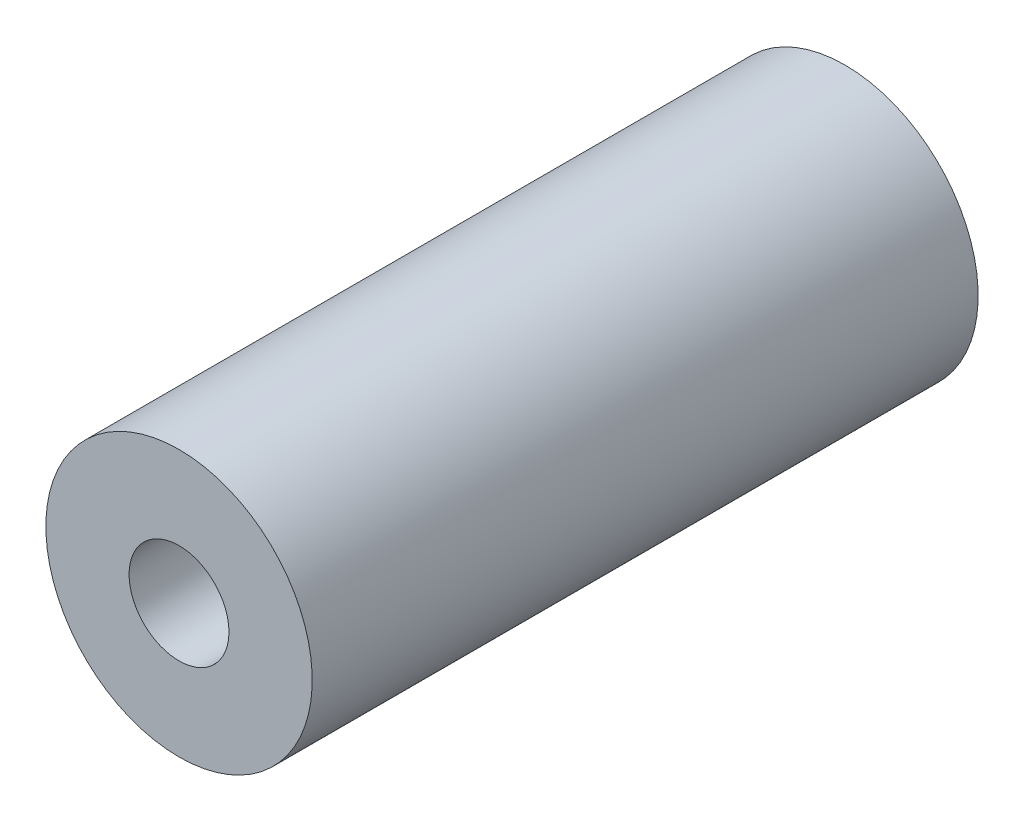
ISO-10303-21;
HEADER;
FILE_DESCRIPTION(('STEP AP214'),'2;1');
FILE_NAME('part.step','',(''),(''),'','','');
FILE_SCHEMA(('AUTOMOTIVE_DESIGN { 1 0 10303 214 1 1 1 1 }'));
ENDSEC;
DATA;
#1=APPLICATION_CONTEXT('core data for automotive mechanical design processes');
#2=APPLICATION_PROTOCOL_DEFINITION('international standard','automotive_design',2000,#1);
#3=PRODUCT_CONTEXT('',#1,'mechanical');
#4=PRODUCT('Part','Part','',(#3));
#5=PRODUCT_RELATED_PRODUCT_CATEGORY('part','',(#4));
#6=PRODUCT_DEFINITION_FORMATION('','',#4);
#7=PRODUCT_DEFINITION_CONTEXT('part definition',#1,'design');
#8=PRODUCT_DEFINITION('design','',#6,#7);
#9=PRODUCT_DEFINITION_SHAPE('','',#8);
#10=(LENGTH_UNIT() NAMED_UNIT(*) SI_UNIT(.MILLI.,.METRE.));
#11=(NAMED_UNIT(*) PLANE_ANGLE_UNIT() SI_UNIT($,.RADIAN.));
#12=(NAMED_UNIT(*) SI_UNIT($,.STERADIAN.) SOLID_ANGLE_UNIT());
#13=UNCERTAINTY_MEASURE_WITH_UNIT(LENGTH_MEASURE(1.E-05),#10,'distance_accuracy_value','');
#14=(GEOMETRIC_REPRESENTATION_CONTEXT(3) GLOBAL_UNCERTAINTY_ASSIGNED_CONTEXT((#13)) GLOBAL_UNIT_ASSIGNED_CONTEXT((#10,
#11,#12)) REPRESENTATION_CONTEXT('',''));
#15=CARTESIAN_POINT('',(0.,0.,0.));
#16=DIRECTION('',(0.,0.,1.));
#17=DIRECTION('',(1.,0.,0.));
#18=AXIS2_PLACEMENT_3D('',#15,#16,#17);
#19=CARTESIAN_POINT('',(0.,-6.,-30.));
#20=DIRECTION('',(0.,0.,1.));
#21=DIRECTION('',(0.,-1.,0.));
#22=AXIS2_PLACEMENT_3D('',#19,#20,#21);
#23=PLANE('',#22);
#24=CARTESIAN_POINT('',(0.,0.,-30.));
#25=DIRECTION('',(0.,0.,-1.));
#26=DIRECTION('',(0.,1.,0.));
#27=AXIS2_PLACEMENT_3D('',#24,#25,#26);
#28=CIRCLE('',#27,6.);
#29=CARTESIAN_POINT('',(0.,6.,-30.));
#30=VERTEX_POINT('',#29);
#31=EDGE_CURVE('E123',#30,#30,#28,.T.);
#32=ORIENTED_EDGE('',*,*,#31,.T.);
#33=EDGE_LOOP('',(#32));
#34=FACE_BOUND('',#33,.T.);
#35=DIRECTION('',(-1.,0.,0.));
#36=VECTOR('',#35,1.);
#37=CARTESIAN_POINT('',(0.,2.67308147399663,-30.));
#38=LINE('',#37,#36);
#39=CARTESIAN_POINT('',(3.62003251827605,2.67308147399663,-30.));
#40=VERTEX_POINT('',#39);
#41=CARTESIAN_POINT('',(-3.62003251827605,2.67308147399663,-30.));
#42=VERTEX_POINT('',#41);
#43=EDGE_CURVE('E55',#40,#42,#38,.T.);
#44=ORIENTED_EDGE('',*,*,#43,.T.);
#45=CARTESIAN_POINT('',(0.,0.,-30.));
#46=DIRECTION('',(0.,0.,-1.));
#47=DIRECTION('',(-1.,0.,0.));
#48=AXIS2_PLACEMENT_3D('',#45,#46,#47);
#49=CIRCLE('',#48,4.5);
#50=EDGE_CURVE('E94',#40,#42,#49,.T.);
#51=ORIENTED_EDGE('',*,*,#50,.F.);
#52=EDGE_LOOP('',(#44,#51));
#53=FACE_BOUND('',#52,.T.);
#54=ADVANCED_FACE('F39',(#34,#53),#23,.F.);
#55=CARTESIAN_POINT('',(0.,0.,-5.));
#56=DIRECTION('',(0.,0.,1.));
#57=DIRECTION('',(1.,0.,0.));
#58=AXIS2_PLACEMENT_3D('',#55,#56,#57);
#59=CYLINDRICAL_SURFACE('',#58,2.25);
#60=CARTESIAN_POINT('',(0.,0.,0.));
#61=DIRECTION('',(0.,0.,1.));
#62=DIRECTION('',(1.,0.,0.));
#63=AXIS2_PLACEMENT_3D('',#60,#61,#62);
#64=CIRCLE('',#63,2.25);
#65=CARTESIAN_POINT('',(2.25,0.,0.));
#66=VERTEX_POINT('',#65);
#67=EDGE_CURVE('E112',#66,#66,#64,.T.);
#68=ORIENTED_EDGE('',*,*,#67,.T.);
#69=EDGE_LOOP('',(#68));
#70=FACE_BOUND('',#69,.T.);
#71=CARTESIAN_POINT('',(0.,0.,-15.));
#72=DIRECTION('',(0.,0.,-1.));
#73=DIRECTION('',(-1.,0.,0.));
#74=AXIS2_PLACEMENT_3D('',#71,#72,#73);
#75=CIRCLE('',#74,2.25);
#76=CARTESIAN_POINT('',(-1.67705098312484,1.5,-15.));
#77=VERTEX_POINT('',#76);
#78=CARTESIAN_POINT('',(1.67705098312484,1.5,-15.));
#79=VERTEX_POINT('',#78);
#80=EDGE_CURVE('E61',#77,#79,#75,.F.);
#81=ORIENTED_EDGE('',*,*,#80,.F.);
#82=DIRECTION('',(0.,0.,1.));
#83=VECTOR('',#82,1.);
#84=CARTESIAN_POINT('',(-1.67705098312484,1.5,-18.));
#85=LINE('',#84,#83);
#86=CARTESIAN_POINT('',(-1.67705098312484,1.5,-5.));
#87=VERTEX_POINT('',#86);
#88=EDGE_CURVE('E108',#77,#87,#85,.T.);
#89=ORIENTED_EDGE('',*,*,#88,.T.);
#90=CARTESIAN_POINT('',(0.,0.,-5.));
#91=DIRECTION('',(0.,0.,1.));
#92=DIRECTION('',(1.,0.,0.));
#93=AXIS2_PLACEMENT_3D('',#90,#91,#92);
#94=CIRCLE('',#93,2.25);
#95=CARTESIAN_POINT('',(1.67705098312484,1.5,-5.));
#96=VERTEX_POINT('',#95);
#97=EDGE_CURVE('E119',#96,#87,#94,.T.);
#98=ORIENTED_EDGE('',*,*,#97,.F.);
#99=DIRECTION('',(0.,0.,1.));
#100=VECTOR('',#99,1.);
#101=CARTESIAN_POINT('',(1.67705098312484,1.5,-18.));
#102=LINE('',#101,#100);
#103=EDGE_CURVE('E109',#79,#96,#102,.T.);
#104=ORIENTED_EDGE('',*,*,#103,.F.);
#105=EDGE_LOOP('',(#81,#89,#98,#104));
#106=FACE_BOUND('',#105,.T.);
#107=ADVANCED_FACE('F144',(#70,#106),#59,.F.);
#108=CARTESIAN_POINT('',(0.,1.5,-18.));
#109=DIRECTION('',(0.,1.,0.));
#110=DIRECTION('',(0.,0.,1.));
#111=AXIS2_PLACEMENT_3D('',#108,#109,#110);
#112=PLANE('',#111);
#113=DIRECTION('',(-1.,0.,0.));
#114=VECTOR('',#113,1.);
#115=CARTESIAN_POINT('',(0.,1.5,-15.));
#116=LINE('',#115,#114);
#117=EDGE_CURVE('E11',#79,#77,#116,.T.);
#118=ORIENTED_EDGE('',*,*,#117,.F.);
#119=ORIENTED_EDGE('',*,*,#103,.T.);
#120=DIRECTION('',(1.,0.,0.));
#121=VECTOR('',#120,1.);
#122=CARTESIAN_POINT('',(0.,1.5,-5.));
#123=LINE('',#122,#121);
#124=EDGE_CURVE('E115',#87,#96,#123,.T.);
#125=ORIENTED_EDGE('',*,*,#124,.F.);
#126=ORIENTED_EDGE('',*,*,#88,.F.);
#127=EDGE_LOOP('',(#118,#119,#125,#126));
#128=FACE_BOUND('',#127,.T.);
#129=ADVANCED_FACE('F136',(#128),#112,.F.);
#130=CARTESIAN_POINT('',(0.,0.,0.));
#131=DIRECTION('',(0.,0.,-1.));
#132=DIRECTION('',(0.,1.,0.));
#133=AXIS2_PLACEMENT_3D('',#130,#131,#132);
#134=PLANE('',#133);
#135=ORIENTED_EDGE('',*,*,#67,.F.);
#136=EDGE_LOOP('',(#135));
#137=FACE_BOUND('',#136,.T.);
#138=CARTESIAN_POINT('',(0.,0.,0.));
#139=DIRECTION('',(0.,0.,-1.));
#140=DIRECTION('',(0.,1.,0.));
#141=AXIS2_PLACEMENT_3D('',#138,#139,#140);
#142=CIRCLE('',#141,6.);
#143=CARTESIAN_POINT('',(0.,6.,0.));
#144=VERTEX_POINT('',#143);
#145=EDGE_CURVE('E48',#144,#144,#142,.T.);
#146=ORIENTED_EDGE('',*,*,#145,.F.);
#147=EDGE_LOOP('',(#146));
#148=FACE_BOUND('',#147,.T.);
#149=ADVANCED_FACE('F41',(#137,#148),#134,.F.);
#150=CARTESIAN_POINT('',(0.,0.,-30.));
#151=DIRECTION('',(0.,0.,-1.));
#152=DIRECTION('',(0.,1.,0.));
#153=AXIS2_PLACEMENT_3D('',#150,#151,#152);
#154=CYLINDRICAL_SURFACE('',#153,6.);
#155=ORIENTED_EDGE('',*,*,#31,.F.);
#156=EDGE_LOOP('',(#155));
#157=FACE_BOUND('',#156,.T.);
#158=ORIENTED_EDGE('',*,*,#145,.T.);
#159=EDGE_LOOP('',(#158));
#160=FACE_BOUND('',#159,.T.);
#161=ADVANCED_FACE('F133',(#157,#160),#154,.T.);
#162=CARTESIAN_POINT('',(0.,0.,-5.));
#163=DIRECTION('',(0.,0.,1.));
#164=DIRECTION('',(1.,0.,0.));
#165=AXIS2_PLACEMENT_3D('',#162,#163,#164);
#166=PLANE('',#165);
#167=ORIENTED_EDGE('',*,*,#124,.T.);
#168=ORIENTED_EDGE('',*,*,#97,.T.);
#169=EDGE_LOOP('',(#167,#168));
#170=FACE_BOUND('',#169,.T.);
#171=ADVANCED_FACE('F142',(#170),#166,.T.);
#172=CARTESIAN_POINT('',(0.,0.,-15.));
#173=DIRECTION('',(0.,0.,-1.));
#174=DIRECTION('',(-1.,0.,0.));
#175=AXIS2_PLACEMENT_3D('',#172,#173,#174);
#176=PLANE('',#175);
#177=DIRECTION('',(-1.,0.,0.));
#178=VECTOR('',#177,1.);
#179=CARTESIAN_POINT('',(0.,2.67308147399663,-15.));
#180=LINE('',#179,#178);
#181=CARTESIAN_POINT('',(3.62003251827605,2.67308147399663,-15.));
#182=VERTEX_POINT('',#181);
#183=CARTESIAN_POINT('',(-3.62003251827605,2.67308147399663,-15.));
#184=VERTEX_POINT('',#183);
#185=EDGE_CURVE('E80',#182,#184,#180,.T.);
#186=ORIENTED_EDGE('',*,*,#185,.F.);
#187=CARTESIAN_POINT('',(0.,0.,-15.));
#188=DIRECTION('',(0.,0.,-1.));
#189=DIRECTION('',(-1.,0.,0.));
#190=AXIS2_PLACEMENT_3D('',#187,#188,#189);
#191=CIRCLE('',#190,4.5);
#192=EDGE_CURVE('E88',#182,#184,#191,.T.);
#193=ORIENTED_EDGE('',*,*,#192,.T.);
#194=EDGE_LOOP('',(#186,#193));
#195=FACE_BOUND('',#194,.T.);
#196=ORIENTED_EDGE('',*,*,#80,.T.);
#197=ORIENTED_EDGE('',*,*,#117,.T.);
#198=EDGE_LOOP('',(#196,#197));
#199=FACE_BOUND('',#198,.T.);
#200=ADVANCED_FACE('F92',(#195,#199),#176,.T.);
#201=CARTESIAN_POINT('',(0.,2.67308147399663,-15.));
#202=DIRECTION('',(0.,-1.,0.));
#203=DIRECTION('',(0.,0.,-1.));
#204=AXIS2_PLACEMENT_3D('',#201,#202,#203);
#205=PLANE('',#204);
#206=ORIENTED_EDGE('',*,*,#43,.F.);
#207=DIRECTION('',(0.,0.,-1.));
#208=VECTOR('',#207,1.);
#209=CARTESIAN_POINT('',(3.62003251827605,2.67308147399663,-15.));
#210=LINE('',#209,#208);
#211=EDGE_CURVE('E77',#182,#40,#210,.T.);
#212=ORIENTED_EDGE('',*,*,#211,.F.);
#213=ORIENTED_EDGE('',*,*,#185,.T.);
#214=DIRECTION('',(0.,0.,-1.));
#215=VECTOR('',#214,1.);
#216=CARTESIAN_POINT('',(-3.62003251827605,2.67308147399663,-15.));
#217=LINE('',#216,#215);
#218=EDGE_CURVE('E87',#184,#42,#217,.T.);
#219=ORIENTED_EDGE('',*,*,#218,.T.);
#220=EDGE_LOOP('',(#206,#212,#213,#219));
#221=FACE_BOUND('',#220,.T.);
#222=ADVANCED_FACE('F79',(#221),#205,.T.);
#223=CARTESIAN_POINT('',(0.,0.,-15.));
#224=DIRECTION('',(0.,0.,-1.));
#225=DIRECTION('',(0.,1.,0.));
#226=AXIS2_PLACEMENT_3D('',#223,#224,#225);
#227=CYLINDRICAL_SURFACE('',#226,4.5);
#228=ORIENTED_EDGE('',*,*,#50,.T.);
#229=ORIENTED_EDGE('',*,*,#218,.F.);
#230=ORIENTED_EDGE('',*,*,#192,.F.);
#231=ORIENTED_EDGE('',*,*,#211,.T.);
#232=EDGE_LOOP('',(#228,#229,#230,#231));
#233=FACE_BOUND('',#232,.T.);
#234=ADVANCED_FACE('F96',(#233),#227,.F.);
#235=CLOSED_SHELL('',(#54,#107,#129,#149,#161,#171,#200,#222,#234));
#236=MANIFOLD_SOLID_BREP('B2',#235);
#237=ADVANCED_BREP_SHAPE_REPRESENTATION('',(#18,#236),#14);
#238=SHAPE_DEFINITION_REPRESENTATION(#9,#237);
ENDSEC;
END-ISO-10303-21;
